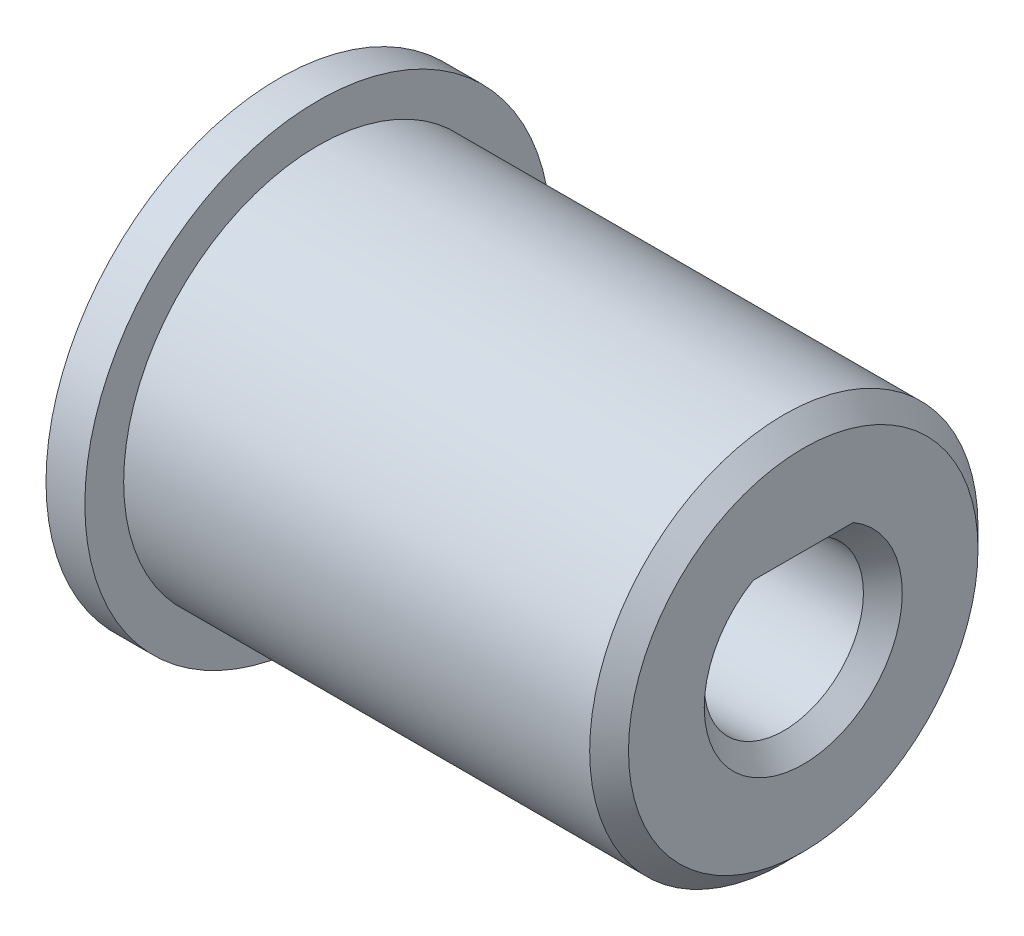
ISO-10303-21;
HEADER;
FILE_DESCRIPTION(('STEP AP214'),'2;1');
FILE_NAME('part.step','',(''),(''),'','','');
FILE_SCHEMA(('AUTOMOTIVE_DESIGN { 1 0 10303 214 1 1 1 1 }'));
ENDSEC;
DATA;
#1=APPLICATION_CONTEXT('core data for automotive mechanical design processes');
#2=APPLICATION_PROTOCOL_DEFINITION('international standard','automotive_design',2000,#1);
#3=PRODUCT_CONTEXT('',#1,'mechanical');
#4=PRODUCT('Part','Part','',(#3));
#5=PRODUCT_RELATED_PRODUCT_CATEGORY('part','',(#4));
#6=PRODUCT_DEFINITION_FORMATION('','',#4);
#7=PRODUCT_DEFINITION_CONTEXT('part definition',#1,'design');
#8=PRODUCT_DEFINITION('design','',#6,#7);
#9=PRODUCT_DEFINITION_SHAPE('','',#8);
#10=(LENGTH_UNIT() NAMED_UNIT(*) SI_UNIT(.MILLI.,.METRE.));
#11=(NAMED_UNIT(*) PLANE_ANGLE_UNIT() SI_UNIT($,.RADIAN.));
#12=(NAMED_UNIT(*) SI_UNIT($,.STERADIAN.) SOLID_ANGLE_UNIT());
#13=UNCERTAINTY_MEASURE_WITH_UNIT(LENGTH_MEASURE(1.E-05),#10,'distance_accuracy_value','');
#14=(GEOMETRIC_REPRESENTATION_CONTEXT(3) GLOBAL_UNCERTAINTY_ASSIGNED_CONTEXT((#13)) GLOBAL_UNIT_ASSIGNED_CONTEXT((#10,
#11,#12)) REPRESENTATION_CONTEXT('',''));
#15=CARTESIAN_POINT('',(0.,0.,0.));
#16=DIRECTION('',(0.,0.,1.));
#17=DIRECTION('',(1.,0.,0.));
#18=AXIS2_PLACEMENT_3D('',#15,#16,#17);
#19=CARTESIAN_POINT('',(25.,0.,0.));
#20=DIRECTION('',(-1.,0.,0.));
#21=DIRECTION('',(0.,0.,1.));
#22=AXIS2_PLACEMENT_3D('',#19,#20,#21);
#23=CYLINDRICAL_SURFACE('',#22,10.);
#24=CARTESIAN_POINT('',(24.,0.,0.));
#25=DIRECTION('',(1.,0.,0.));
#26=DIRECTION('',(0.,0.,-1.));
#27=AXIS2_PLACEMENT_3D('',#24,#25,#26);
#28=CIRCLE('',#27,10.);
#29=CARTESIAN_POINT('',(24.,0.,-10.));
#30=VERTEX_POINT('',#29);
#31=EDGE_CURVE('E227',#30,#30,#28,.F.);
#32=ORIENTED_EDGE('',*,*,#31,.T.);
#33=EDGE_LOOP('',(#32));
#34=FACE_BOUND('',#33,.T.);
#35=CARTESIAN_POINT('',(0.,0.,0.));
#36=DIRECTION('',(1.,0.,0.));
#37=DIRECTION('',(0.,0.,-1.));
#38=AXIS2_PLACEMENT_3D('',#35,#36,#37);
#39=CIRCLE('',#38,10.);
#40=CARTESIAN_POINT('',(0.,0.,-10.));
#41=VERTEX_POINT('',#40);
#42=EDGE_CURVE('E116',#41,#41,#39,.T.);
#43=ORIENTED_EDGE('',*,*,#42,.T.);
#44=EDGE_LOOP('',(#43));
#45=FACE_BOUND('',#44,.T.);
#46=ADVANCED_FACE('F43',(#34,#45),#23,.T.);
#47=CARTESIAN_POINT('',(25.,0.,0.));
#48=DIRECTION('',(1.,0.,0.));
#49=DIRECTION('',(0.,0.,-1.));
#50=AXIS2_PLACEMENT_3D('',#47,#48,#49);
#51=PLANE('',#50);
#52=CARTESIAN_POINT('',(25.,0.,0.));
#53=DIRECTION('',(1.,0.,0.));
#54=DIRECTION('',(0.,0.,-1.));
#55=AXIS2_PLACEMENT_3D('',#52,#53,#54);
#56=CIRCLE('',#55,9.00000000000001);
#57=CARTESIAN_POINT('',(25.,0.,-9.00000000000001));
#58=VERTEX_POINT('',#57);
#59=EDGE_CURVE('E129',#58,#58,#56,.T.);
#60=ORIENTED_EDGE('',*,*,#59,.T.);
#61=EDGE_LOOP('',(#60));
#62=FACE_BOUND('',#61,.T.);
#63=CARTESIAN_POINT('',(25.,0.,0.));
#64=DIRECTION('',(1.,0.,0.));
#65=DIRECTION('',(0.,0.,-1.));
#66=AXIS2_PLACEMENT_3D('',#63,#64,#65);
#67=CIRCLE('',#66,5.10000000000001);
#68=CARTESIAN_POINT('',(25.,4.40000000000001,-2.57875939164552));
#69=VERTEX_POINT('',#68);
#70=CARTESIAN_POINT('',(25.,4.40000000000001,2.57875939164552));
#71=VERTEX_POINT('',#70);
#72=EDGE_CURVE('E58',#69,#71,#67,.F.);
#73=ORIENTED_EDGE('',*,*,#72,.T.);
#74=DIRECTION('',(0.,0.,-1.));
#75=VECTOR('',#74,1.);
#76=CARTESIAN_POINT('',(25.,4.40000000000001,-2.29128784747792));
#77=LINE('',#76,#75);
#78=EDGE_CURVE('E125',#71,#69,#77,.T.);
#79=ORIENTED_EDGE('',*,*,#78,.T.);
#80=EDGE_LOOP('',(#73,#79));
#81=FACE_BOUND('',#80,.T.);
#82=ADVANCED_FACE('F179',(#62,#81),#51,.T.);
#83=CARTESIAN_POINT('',(-2.,0.,0.));
#84=DIRECTION('',(1.,0.,0.));
#85=DIRECTION('',(0.,0.,-1.));
#86=AXIS2_PLACEMENT_3D('',#83,#84,#85);
#87=CYLINDRICAL_SURFACE('',#86,12.);
#88=CARTESIAN_POINT('',(-2.,0.,0.));
#89=DIRECTION('',(-1.,0.,0.));
#90=DIRECTION('',(0.,0.,1.));
#91=AXIS2_PLACEMENT_3D('',#88,#89,#90);
#92=CIRCLE('',#91,12.);
#93=CARTESIAN_POINT('',(-2.,0.,12.));
#94=VERTEX_POINT('',#93);
#95=EDGE_CURVE('E113',#94,#94,#92,.T.);
#96=ORIENTED_EDGE('',*,*,#95,.F.);
#97=EDGE_LOOP('',(#96));
#98=FACE_BOUND('',#97,.T.);
#99=CARTESIAN_POINT('',(0.,0.,0.));
#100=DIRECTION('',(-1.,0.,0.));
#101=DIRECTION('',(0.,0.,1.));
#102=AXIS2_PLACEMENT_3D('',#99,#100,#101);
#103=CIRCLE('',#102,12.);
#104=CARTESIAN_POINT('',(0.,0.,12.));
#105=VERTEX_POINT('',#104);
#106=EDGE_CURVE('E110',#105,#105,#103,.T.);
#107=ORIENTED_EDGE('',*,*,#106,.T.);
#108=EDGE_LOOP('',(#107));
#109=FACE_BOUND('',#108,.T.);
#110=ADVANCED_FACE('F185',(#98,#109),#87,.T.);
#111=CARTESIAN_POINT('',(-2.,0.,0.));
#112=DIRECTION('',(-1.,0.,0.));
#113=DIRECTION('',(0.,0.,1.));
#114=AXIS2_PLACEMENT_3D('',#111,#112,#113);
#115=PLANE('',#114);
#116=CARTESIAN_POINT('',(-2.,0.,4.25));
#117=DIRECTION('',(-1.,0.,0.));
#118=DIRECTION('',(0.,0.,1.));
#119=AXIS2_PLACEMENT_3D('',#116,#117,#118);
#120=CIRCLE('',#119,2.55000000000002);
#121=CARTESIAN_POINT('',(-2.,0.,6.80000000000002));
#122=VERTEX_POINT('',#121);
#123=EDGE_CURVE('E52',#122,#122,#120,.F.);
#124=ORIENTED_EDGE('',*,*,#123,.T.);
#125=EDGE_LOOP('',(#124));
#126=FACE_BOUND('',#125,.T.);
#127=CARTESIAN_POINT('',(-2.,0.,-4.25));
#128=DIRECTION('',(-1.,0.,0.));
#129=DIRECTION('',(0.,0.,1.));
#130=AXIS2_PLACEMENT_3D('',#127,#128,#129);
#131=CIRCLE('',#130,2.55000000000002);
#132=CARTESIAN_POINT('',(-2.,0.,-1.69999999999998));
#133=VERTEX_POINT('',#132);
#134=EDGE_CURVE('E226',#133,#133,#131,.F.);
#135=ORIENTED_EDGE('',*,*,#134,.T.);
#136=EDGE_LOOP('',(#135));
#137=FACE_BOUND('',#136,.T.);
#138=ORIENTED_EDGE('',*,*,#95,.T.);
#139=EDGE_LOOP('',(#138));
#140=FACE_BOUND('',#139,.T.);
#141=ADVANCED_FACE('F193',(#126,#137,#140),#115,.T.);
#142=CARTESIAN_POINT('',(0.,0.,0.));
#143=DIRECTION('',(-1.,0.,0.));
#144=DIRECTION('',(0.,0.,1.));
#145=AXIS2_PLACEMENT_3D('',#142,#143,#144);
#146=PLANE('',#145);
#147=ORIENTED_EDGE('',*,*,#42,.F.);
#148=EDGE_LOOP('',(#147));
#149=FACE_BOUND('',#148,.T.);
#150=ORIENTED_EDGE('',*,*,#106,.F.);
#151=EDGE_LOOP('',(#150));
#152=FACE_BOUND('',#151,.T.);
#153=ADVANCED_FACE('F195',(#149,#152),#146,.F.);
#154=CARTESIAN_POINT('',(9.99999999999999,0.,0.));
#155=DIRECTION('',(1.,0.,0.));
#156=DIRECTION('',(0.,0.,-1.));
#157=AXIS2_PLACEMENT_3D('',#154,#155,#156);
#158=CYLINDRICAL_SURFACE('',#157,4.1);
#159=DIRECTION('',(1.,0.,0.));
#160=VECTOR('',#159,1.);
#161=CARTESIAN_POINT('',(9.99999999999999,3.4,2.29128784747792));
#162=LINE('',#161,#160);
#163=CARTESIAN_POINT('',(9.99999999999999,3.4,2.29128784747792));
#164=VERTEX_POINT('',#163);
#165=CARTESIAN_POINT('',(24.,3.4,2.29128784747792));
#166=VERTEX_POINT('',#165);
#167=EDGE_CURVE('E107',#164,#166,#162,.T.);
#168=ORIENTED_EDGE('',*,*,#167,.T.);
#169=CARTESIAN_POINT('',(24.,0.,0.));
#170=DIRECTION('',(1.,0.,0.));
#171=DIRECTION('',(0.,0.,-1.));
#172=AXIS2_PLACEMENT_3D('',#169,#170,#171);
#173=CIRCLE('',#172,4.1);
#174=CARTESIAN_POINT('',(24.,3.4,-2.29128784747792));
#175=VERTEX_POINT('',#174);
#176=EDGE_CURVE('E127',#166,#175,#173,.T.);
#177=ORIENTED_EDGE('',*,*,#176,.T.);
#178=DIRECTION('',(1.,0.,0.));
#179=VECTOR('',#178,1.);
#180=CARTESIAN_POINT('',(9.99999999999999,3.4,-2.29128784747792));
#181=LINE('',#180,#179);
#182=CARTESIAN_POINT('',(9.99999999999999,3.4,-2.29128784747792));
#183=VERTEX_POINT('',#182);
#184=EDGE_CURVE('E106',#183,#175,#181,.T.);
#185=ORIENTED_EDGE('',*,*,#184,.F.);
#186=CARTESIAN_POINT('',(9.99999999999999,0.,0.));
#187=DIRECTION('',(1.,0.,0.));
#188=DIRECTION('',(0.,0.,-1.));
#189=AXIS2_PLACEMENT_3D('',#186,#187,#188);
#190=CIRCLE('',#189,4.1);
#191=EDGE_CURVE('E100',#164,#183,#190,.T.);
#192=ORIENTED_EDGE('',*,*,#191,.F.);
#193=EDGE_LOOP('',(#168,#177,#185,#192));
#194=FACE_BOUND('',#193,.T.);
#195=ADVANCED_FACE('F198',(#194),#158,.F.);
#196=CARTESIAN_POINT('',(9.99999999999999,3.4,2.29128784747792));
#197=DIRECTION('',(0.,1.,0.));
#198=DIRECTION('',(0.,0.,1.));
#199=AXIS2_PLACEMENT_3D('',#196,#197,#198);
#200=PLANE('',#199);
#201=ORIENTED_EDGE('',*,*,#184,.T.);
#202=DIRECTION('',(0.,0.,1.));
#203=VECTOR('',#202,1.);
#204=CARTESIAN_POINT('',(24.,3.4,2.29128784747792));
#205=LINE('',#204,#203);
#206=EDGE_CURVE('E121',#175,#166,#205,.T.);
#207=ORIENTED_EDGE('',*,*,#206,.T.);
#208=ORIENTED_EDGE('',*,*,#167,.F.);
#209=DIRECTION('',(0.,0.,1.));
#210=VECTOR('',#209,1.);
#211=CARTESIAN_POINT('',(9.99999999999999,3.4,2.29128784747792));
#212=LINE('',#211,#210);
#213=EDGE_CURVE('E103',#183,#164,#212,.T.);
#214=ORIENTED_EDGE('',*,*,#213,.F.);
#215=EDGE_LOOP('',(#201,#207,#208,#214));
#216=FACE_BOUND('',#215,.T.);
#217=ADVANCED_FACE('F205',(#216),#200,.F.);
#218=CARTESIAN_POINT('',(9.99999999999999,0.,0.));
#219=DIRECTION('',(1.,0.,0.));
#220=DIRECTION('',(0.,0.,-1.));
#221=AXIS2_PLACEMENT_3D('',#218,#219,#220);
#222=PLANE('',#221);
#223=ORIENTED_EDGE('',*,*,#191,.T.);
#224=ORIENTED_EDGE('',*,*,#213,.T.);
#225=EDGE_LOOP('',(#223,#224));
#226=FACE_BOUND('',#225,.T.);
#227=ADVANCED_FACE('F153',(#226),#222,.T.);
#228=CARTESIAN_POINT('',(24.,0.,0.));
#229=DIRECTION('',(1.,0.,0.));
#230=DIRECTION('',(0.,0.,-1.));
#231=AXIS2_PLACEMENT_3D('',#228,#229,#230);
#232=CONICAL_SURFACE('',#231,4.1,0.785398163397452);
#233=CARTESIAN_POINT('',(24.,3.4,2.29128784747792));
#234=CARTESIAN_POINT('',(24.0831242427974,3.48312424279741,2.31668096126655));
#235=CARTESIAN_POINT('',(24.1663092672851,3.56630926728513,2.34167403400163));
#236=CARTESIAN_POINT('',(24.3327856586927,3.7327856586927,2.39092206324513));
#237=CARTESIAN_POINT('',(24.4160770219915,3.81607702199146,2.41517704422379));
#238=CARTESIAN_POINT('',(24.5827556712635,3.9827556712635,2.46301232696149));
#239=CARTESIAN_POINT('',(24.666142956404,4.06614295640399,2.4865926345328));
#240=CARTESIAN_POINT('',(24.8330072721504,4.23300727215043,2.53313053152915));
#241=CARTESIAN_POINT('',(24.9164843056415,4.3164843056415,2.55608810027261));
#242=CARTESIAN_POINT('',(25.,4.40000000000001,2.57875939164552));
#243=B_SPLINE_CURVE_WITH_KNOTS('',3,(#233,#234,#235,#236,#237,#238,#239,#240,#241,#242),
.UNSPECIFIED.,.F.,.F.,(4,2,2,2,4),(0.,0.360798895502577,0.72158581623437,1.08236962786738,
1.44316540673106),.UNSPECIFIED.);
#244=EDGE_CURVE('E97',#71,#166,#243,.F.);
#245=ORIENTED_EDGE('',*,*,#244,.F.);
#246=ORIENTED_EDGE('',*,*,#72,.F.);
#247=CARTESIAN_POINT('',(25.,4.40000000000001,-2.57875939164552));
#248=CARTESIAN_POINT('',(24.9164843056415,4.3164843056415,-2.55608810027261));
#249=CARTESIAN_POINT('',(24.8330072721504,4.23300727215043,-2.53313053152915));
#250=CARTESIAN_POINT('',(24.666142956404,4.06614295640399,-2.4865926345328));
#251=CARTESIAN_POINT('',(24.5827556712635,3.9827556712635,-2.46301232696149));
#252=CARTESIAN_POINT('',(24.4160770219914,3.81607702199145,-2.41517704422379));
#253=CARTESIAN_POINT('',(24.3327856586927,3.73278565869269,-2.39092206324512));
#254=CARTESIAN_POINT('',(24.1663092672851,3.56630926728512,-2.34167403400163));
#255=CARTESIAN_POINT('',(24.0831242427974,3.48312424279741,-2.31668096126654));
#256=CARTESIAN_POINT('',(24.,3.4,-2.29128784747792));
#257=B_SPLINE_CURVE_WITH_KNOTS('',3,(#247,#248,#249,#250,#251,#252,#253,#254,#255,#256),
.UNSPECIFIED.,.F.,.F.,(4,2,2,2,4),(0.,0.360795778863684,0.721579590496693,1.08236651122849,
1.44316540673106),.UNSPECIFIED.);
#258=EDGE_CURVE('E65',#175,#69,#257,.F.);
#259=ORIENTED_EDGE('',*,*,#258,.F.);
#260=ORIENTED_EDGE('',*,*,#176,.F.);
#261=EDGE_LOOP('',(#245,#246,#259,#260));
#262=FACE_BOUND('',#261,.T.);
#263=ADVANCED_FACE('F147',(#262),#232,.F.);
#264=CARTESIAN_POINT('',(24.,3.4,2.29128784747792));
#265=DIRECTION('',(0.70710678118655,-0.707106781186545,0.));
#266=DIRECTION('',(0.,0.,-1.));
#267=AXIS2_PLACEMENT_3D('',#264,#265,#266);
#268=PLANE('',#267);
#269=ORIENTED_EDGE('',*,*,#258,.T.);
#270=ORIENTED_EDGE('',*,*,#78,.F.);
#271=ORIENTED_EDGE('',*,*,#244,.T.);
#272=ORIENTED_EDGE('',*,*,#206,.F.);
#273=EDGE_LOOP('',(#269,#270,#271,#272));
#274=FACE_BOUND('',#273,.T.);
#275=ADVANCED_FACE('F143',(#274),#268,.T.);
#276=CARTESIAN_POINT('',(25.,0.,0.));
#277=DIRECTION('',(-1.,0.,0.));
#278=DIRECTION('',(0.,0.,1.));
#279=AXIS2_PLACEMENT_3D('',#276,#277,#278);
#280=CONICAL_SURFACE('',#279,9.00000000000001,0.785398163397445);
#281=ORIENTED_EDGE('',*,*,#31,.F.);
#282=EDGE_LOOP('',(#281));
#283=FACE_BOUND('',#282,.T.);
#284=ORIENTED_EDGE('',*,*,#59,.F.);
#285=EDGE_LOOP('',(#284));
#286=FACE_BOUND('',#285,.T.);
#287=ADVANCED_FACE('F156',(#283,#286),#280,.T.);
#288=CARTESIAN_POINT('',(5.,0.,4.25));
#289=DIRECTION('',(-1.,0.,0.));
#290=DIRECTION('',(0.,0.,1.));
#291=AXIS2_PLACEMENT_3D('',#288,#289,#290);
#292=CONICAL_SURFACE('',#291,1.55,1.02974425867665);
#293=CARTESIAN_POINT('',(5.93133395949272,0.,4.25));
#294=VERTEX_POINT('',#293);
#295=VERTEX_LOOP('',#294);
#296=FACE_BOUND('',#295,.T.);
#297=CARTESIAN_POINT('',(5.,0.,4.25));
#298=DIRECTION('',(-1.,0.,0.));
#299=DIRECTION('',(0.,0.,1.));
#300=AXIS2_PLACEMENT_3D('',#297,#298,#299);
#301=CIRCLE('',#300,1.55);
#302=CARTESIAN_POINT('',(5.,0.,5.8));
#303=VERTEX_POINT('',#302);
#304=EDGE_CURVE('E94',#303,#303,#301,.T.);
#305=ORIENTED_EDGE('',*,*,#304,.T.);
#306=EDGE_LOOP('',(#305));
#307=FACE_BOUND('',#306,.T.);
#308=ADVANCED_FACE('F162',(#296,#307),#292,.F.);
#309=CARTESIAN_POINT('',(-2.,0.,4.25));
#310=DIRECTION('',(-1.,0.,0.));
#311=DIRECTION('',(0.,0.,1.));
#312=AXIS2_PLACEMENT_3D('',#309,#310,#311);
#313=CYLINDRICAL_SURFACE('',#312,1.55);
#314=CARTESIAN_POINT('',(-0.999999999999982,0.,4.25));
#315=DIRECTION('',(-1.,0.,0.));
#316=DIRECTION('',(0.,0.,1.));
#317=AXIS2_PLACEMENT_3D('',#314,#315,#316);
#318=CIRCLE('',#317,1.55);
#319=CARTESIAN_POINT('',(-0.999999999999982,0.,5.8));
#320=VERTEX_POINT('',#319);
#321=EDGE_CURVE('E223',#320,#320,#318,.T.);
#322=ORIENTED_EDGE('',*,*,#321,.T.);
#323=EDGE_LOOP('',(#322));
#324=FACE_BOUND('',#323,.T.);
#325=ORIENTED_EDGE('',*,*,#304,.F.);
#326=EDGE_LOOP('',(#325));
#327=FACE_BOUND('',#326,.T.);
#328=ADVANCED_FACE('F88',(#324,#327),#313,.F.);
#329=CARTESIAN_POINT('',(5.,0.,-4.25));
#330=DIRECTION('',(-1.,0.,0.));
#331=DIRECTION('',(0.,0.,1.));
#332=AXIS2_PLACEMENT_3D('',#329,#330,#331);
#333=CONICAL_SURFACE('',#332,1.55,1.02974425867665);
#334=CARTESIAN_POINT('',(5.93133395949272,0.,-4.25));
#335=VERTEX_POINT('',#334);
#336=VERTEX_LOOP('',#335);
#337=FACE_BOUND('',#336,.T.);
#338=CARTESIAN_POINT('',(5.,0.,-4.25));
#339=DIRECTION('',(-1.,0.,0.));
#340=DIRECTION('',(0.,0.,1.));
#341=AXIS2_PLACEMENT_3D('',#338,#339,#340);
#342=CIRCLE('',#341,1.55);
#343=CARTESIAN_POINT('',(5.,0.,-2.7));
#344=VERTEX_POINT('',#343);
#345=EDGE_CURVE('E92',#344,#344,#342,.T.);
#346=ORIENTED_EDGE('',*,*,#345,.T.);
#347=EDGE_LOOP('',(#346));
#348=FACE_BOUND('',#347,.T.);
#349=ADVANCED_FACE('F84',(#337,#348),#333,.F.);
#350=CARTESIAN_POINT('',(-2.,0.,-4.25));
#351=DIRECTION('',(-1.,0.,0.));
#352=DIRECTION('',(0.,0.,1.));
#353=AXIS2_PLACEMENT_3D('',#350,#351,#352);
#354=CYLINDRICAL_SURFACE('',#353,1.55);
#355=CARTESIAN_POINT('',(-0.999999999999982,0.,-4.25));
#356=DIRECTION('',(-1.,0.,0.));
#357=DIRECTION('',(0.,0.,1.));
#358=AXIS2_PLACEMENT_3D('',#355,#356,#357);
#359=CIRCLE('',#358,1.55);
#360=CARTESIAN_POINT('',(-0.999999999999982,0.,-2.7));
#361=VERTEX_POINT('',#360);
#362=EDGE_CURVE('E11',#361,#361,#359,.T.);
#363=ORIENTED_EDGE('',*,*,#362,.T.);
#364=EDGE_LOOP('',(#363));
#365=FACE_BOUND('',#364,.T.);
#366=ORIENTED_EDGE('',*,*,#345,.F.);
#367=EDGE_LOOP('',(#366));
#368=FACE_BOUND('',#367,.T.);
#369=ADVANCED_FACE('F87',(#365,#368),#354,.F.);
#370=CARTESIAN_POINT('',(-0.999999999999982,0.,4.25));
#371=DIRECTION('',(-1.,0.,0.));
#372=DIRECTION('',(0.,0.,1.));
#373=AXIS2_PLACEMENT_3D('',#370,#371,#372);
#374=CONICAL_SURFACE('',#373,1.55,0.785398163397449);
#375=ORIENTED_EDGE('',*,*,#123,.F.);
#376=EDGE_LOOP('',(#375));
#377=FACE_BOUND('',#376,.T.);
#378=ORIENTED_EDGE('',*,*,#321,.F.);
#379=EDGE_LOOP('',(#378));
#380=FACE_BOUND('',#379,.T.);
#381=ADVANCED_FACE('F164',(#377,#380),#374,.F.);
#382=CARTESIAN_POINT('',(-0.999999999999982,0.,-4.25));
#383=DIRECTION('',(-1.,0.,0.));
#384=DIRECTION('',(0.,0.,1.));
#385=AXIS2_PLACEMENT_3D('',#382,#383,#384);
#386=CONICAL_SURFACE('',#385,1.55,0.785398163397449);
#387=ORIENTED_EDGE('',*,*,#134,.F.);
#388=EDGE_LOOP('',(#387));
#389=FACE_BOUND('',#388,.T.);
#390=ORIENTED_EDGE('',*,*,#362,.F.);
#391=EDGE_LOOP('',(#390));
#392=FACE_BOUND('',#391,.T.);
#393=ADVANCED_FACE('F46',(#389,#392),#386,.F.);
#394=CLOSED_SHELL('',(#46,#82,#110,#141,#153,#195,#217,#227,#263,#275,#287,#308,#328,#349,#369,
#381,#393));
#395=MANIFOLD_SOLID_BREP('B2',#394);
#396=ADVANCED_BREP_SHAPE_REPRESENTATION('',(#18,#395),#14);
#397=SHAPE_DEFINITION_REPRESENTATION(#9,#396);
ENDSEC;
END-ISO-10303-21;
